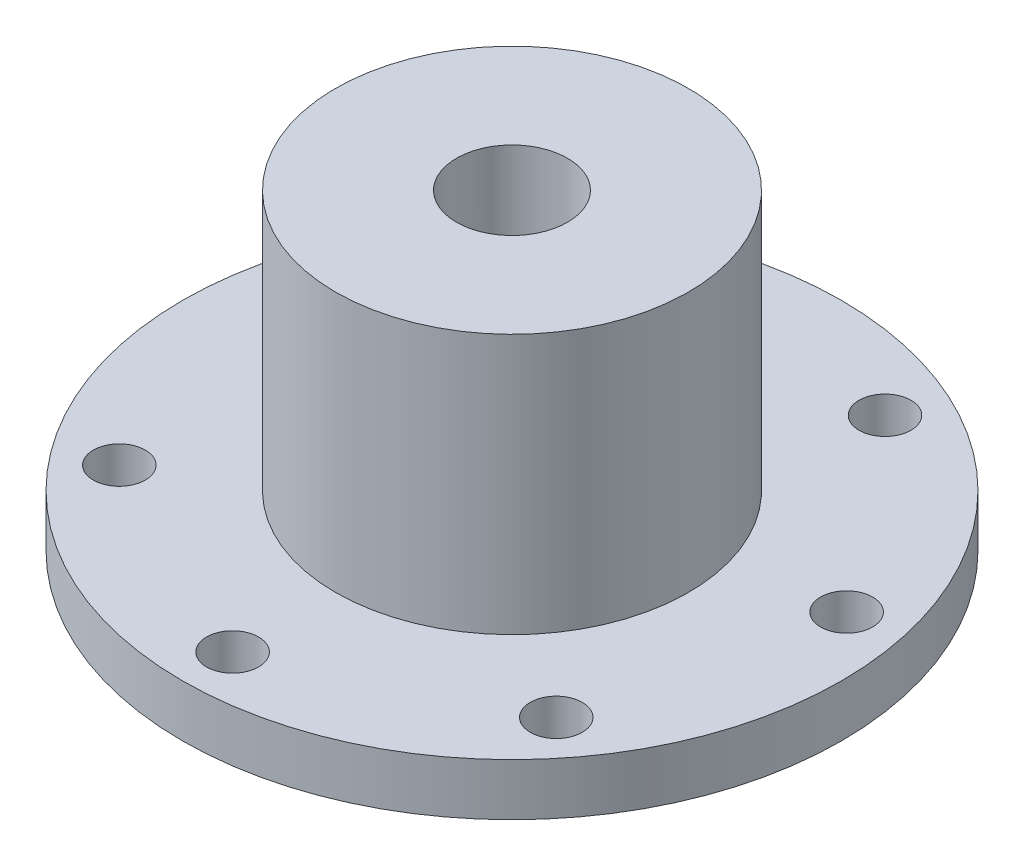
ISO-10303-21;
HEADER;
FILE_DESCRIPTION(('STEP AP214'),'2;1');
FILE_NAME('part.step','',(''),(''),'','','');
FILE_SCHEMA(('AUTOMOTIVE_DESIGN { 1 0 10303 214 1 1 1 1 }'));
ENDSEC;
DATA;
#1=APPLICATION_CONTEXT('core data for automotive mechanical design processes');
#2=APPLICATION_PROTOCOL_DEFINITION('international standard','automotive_design',2000,#1);
#3=PRODUCT_CONTEXT('',#1,'mechanical');
#4=PRODUCT('Part','Part','',(#3));
#5=PRODUCT_RELATED_PRODUCT_CATEGORY('part','',(#4));
#6=PRODUCT_DEFINITION_FORMATION('','',#4);
#7=PRODUCT_DEFINITION_CONTEXT('part definition',#1,'design');
#8=PRODUCT_DEFINITION('design','',#6,#7);
#9=PRODUCT_DEFINITION_SHAPE('','',#8);
#10=(LENGTH_UNIT() NAMED_UNIT(*) SI_UNIT(.MILLI.,.METRE.));
#11=(NAMED_UNIT(*) PLANE_ANGLE_UNIT() SI_UNIT($,.RADIAN.));
#12=(NAMED_UNIT(*) SI_UNIT($,.STERADIAN.) SOLID_ANGLE_UNIT());
#13=UNCERTAINTY_MEASURE_WITH_UNIT(LENGTH_MEASURE(1.E-05),#10,'distance_accuracy_value','');
#14=(GEOMETRIC_REPRESENTATION_CONTEXT(3) GLOBAL_UNCERTAINTY_ASSIGNED_CONTEXT((#13)) GLOBAL_UNIT_ASSIGNED_CONTEXT((#10,
#11,#12)) REPRESENTATION_CONTEXT('',''));
#15=CARTESIAN_POINT('',(0.,0.,0.));
#16=DIRECTION('',(0.,0.,1.));
#17=DIRECTION('',(1.,0.,0.));
#18=AXIS2_PLACEMENT_3D('',#15,#16,#17);
#19=CARTESIAN_POINT('',(0.,-3.,0.));
#20=DIRECTION('',(0.,1.,0.));
#21=DIRECTION('',(0.,0.,1.));
#22=AXIS2_PLACEMENT_3D('',#19,#20,#21);
#23=CYLINDRICAL_SURFACE('',#22,19.);
#24=CARTESIAN_POINT('',(0.,-3.,0.));
#25=DIRECTION('',(0.,1.,0.));
#26=DIRECTION('',(0.,0.,1.));
#27=AXIS2_PLACEMENT_3D('',#24,#25,#26);
#28=CIRCLE('',#27,19.);
#29=CARTESIAN_POINT('',(0.,-3.,19.));
#30=VERTEX_POINT('',#29);
#31=EDGE_CURVE('E39',#30,#30,#28,.T.);
#32=ORIENTED_EDGE('',*,*,#31,.T.);
#33=EDGE_LOOP('',(#32));
#34=FACE_BOUND('',#33,.T.);
#35=CARTESIAN_POINT('',(0.,0.,0.));
#36=DIRECTION('',(0.,1.,0.));
#37=DIRECTION('',(0.,0.,1.));
#38=AXIS2_PLACEMENT_3D('',#35,#36,#37);
#39=CIRCLE('',#38,19.);
#40=CARTESIAN_POINT('',(0.,0.,19.));
#41=VERTEX_POINT('',#40);
#42=EDGE_CURVE('E44',#41,#41,#39,.T.);
#43=ORIENTED_EDGE('',*,*,#42,.F.);
#44=EDGE_LOOP('',(#43));
#45=FACE_BOUND('',#44,.T.);
#46=ADVANCED_FACE('F32',(#34,#45),#23,.T.);
#47=CARTESIAN_POINT('',(0.,-3.,0.));
#48=DIRECTION('',(0.,1.,0.));
#49=DIRECTION('',(0.,0.,1.));
#50=AXIS2_PLACEMENT_3D('',#47,#48,#49);
#51=PLANE('',#50);
#52=CARTESIAN_POINT('',(0.,-3.,16.1125379466549));
#53=DIRECTION('',(0.,-1.,0.));
#54=DIRECTION('',(0.,0.,-1.));
#55=AXIS2_PLACEMENT_3D('',#52,#53,#54);
#56=CIRCLE('',#55,1.5);
#57=CARTESIAN_POINT('',(0.,-3.,14.6125379466549));
#58=VERTEX_POINT('',#57);
#59=EDGE_CURVE('E53',#58,#58,#56,.T.);
#60=ORIENTED_EDGE('',*,*,#59,.F.);
#61=EDGE_LOOP('',(#60));
#62=FACE_BOUND('',#61,.T.);
#63=CARTESIAN_POINT('',(-12.5972894291553,-3.,10.0460030918006));
#64=DIRECTION('',(0.,-1.,0.));
#65=DIRECTION('',(0.,0.,-1.));
#66=AXIS2_PLACEMENT_3D('',#63,#64,#65);
#67=CIRCLE('',#66,1.5);
#68=CARTESIAN_POINT('',(-12.5972894291553,-3.,8.54600309180057));
#69=VERTEX_POINT('',#68);
#70=EDGE_CURVE('E182',#69,#69,#67,.T.);
#71=ORIENTED_EDGE('',*,*,#70,.F.);
#72=EDGE_LOOP('',(#71));
#73=FACE_BOUND('',#72,.T.);
#74=CARTESIAN_POINT('',(-6.99096821096666,-3.,-14.5168950728328));
#75=DIRECTION('',(0.,-1.,0.));
#76=DIRECTION('',(0.,0.,-1.));
#77=AXIS2_PLACEMENT_3D('',#74,#75,#76);
#78=CIRCLE('',#77,1.5);
#79=CARTESIAN_POINT('',(-6.99096821096666,-3.,-16.0168950728328));
#80=VERTEX_POINT('',#79);
#81=EDGE_CURVE('E177',#80,#80,#78,.T.);
#82=ORIENTED_EDGE('',*,*,#81,.F.);
#83=EDGE_LOOP('',(#82));
#84=FACE_BOUND('',#83,.T.);
#85=CARTESIAN_POINT('',(-15.7085629802817,-3.,-3.58537699229698));
#86=DIRECTION('',(0.,-1.,0.));
#87=DIRECTION('',(0.,0.,-1.));
#88=AXIS2_PLACEMENT_3D('',#85,#86,#87);
#89=CIRCLE('',#88,1.5);
#90=CARTESIAN_POINT('',(-15.7085629802817,-3.,-5.08537699229698));
#91=VERTEX_POINT('',#90);
#92=EDGE_CURVE('E185',#91,#91,#89,.T.);
#93=ORIENTED_EDGE('',*,*,#92,.F.);
#94=EDGE_LOOP('',(#93));
#95=FACE_BOUND('',#94,.T.);
#96=CARTESIAN_POINT('',(12.5972894291559,-3.,10.0460030918018));
#97=DIRECTION('',(0.,-1.,0.));
#98=DIRECTION('',(0.,0.,-1.));
#99=AXIS2_PLACEMENT_3D('',#96,#97,#98);
#100=CIRCLE('',#99,1.5);
#101=CARTESIAN_POINT('',(12.5972894291559,-3.,8.54600309180181));
#102=VERTEX_POINT('',#101);
#103=EDGE_CURVE('E81',#102,#102,#100,.T.);
#104=ORIENTED_EDGE('',*,*,#103,.F.);
#105=EDGE_LOOP('',(#104));
#106=FACE_BOUND('',#105,.T.);
#107=CARTESIAN_POINT('',(15.7085629802836,-3.,-3.58537699229543));
#108=DIRECTION('',(0.,-1.,0.));
#109=DIRECTION('',(0.,0.,-1.));
#110=AXIS2_PLACEMENT_3D('',#107,#108,#109);
#111=CIRCLE('',#110,1.5);
#112=CARTESIAN_POINT('',(15.7085629802836,-3.,-5.08537699229543));
#113=VERTEX_POINT('',#112);
#114=EDGE_CURVE('E176',#113,#113,#111,.T.);
#115=ORIENTED_EDGE('',*,*,#114,.F.);
#116=EDGE_LOOP('',(#115));
#117=FACE_BOUND('',#116,.T.);
#118=CARTESIAN_POINT('',(6.99096821096968,-3.,-14.5168950728321));
#119=DIRECTION('',(0.,-1.,0.));
#120=DIRECTION('',(0.,0.,-1.));
#121=AXIS2_PLACEMENT_3D('',#118,#119,#120);
#122=CIRCLE('',#121,1.5);
#123=CARTESIAN_POINT('',(6.99096821096968,-3.,-16.0168950728321));
#124=VERTEX_POINT('',#123);
#125=EDGE_CURVE('E174',#124,#124,#122,.T.);
#126=ORIENTED_EDGE('',*,*,#125,.F.);
#127=EDGE_LOOP('',(#126));
#128=FACE_BOUND('',#127,.T.);
#129=CARTESIAN_POINT('',(0.,-3.,0.));
#130=DIRECTION('',(0.,1.,0.));
#131=DIRECTION('',(0.,0.,1.));
#132=AXIS2_PLACEMENT_3D('',#129,#130,#131);
#133=CIRCLE('',#132,4.5);
#134=CARTESIAN_POINT('',(0.,-3.,4.5));
#135=VERTEX_POINT('',#134);
#136=EDGE_CURVE('E10',#135,#135,#133,.F.);
#137=ORIENTED_EDGE('',*,*,#136,.F.);
#138=EDGE_LOOP('',(#137));
#139=FACE_BOUND('',#138,.T.);
#140=ORIENTED_EDGE('',*,*,#31,.F.);
#141=EDGE_LOOP('',(#140));
#142=FACE_BOUND('',#141,.T.);
#143=ADVANCED_FACE('F126',(#62,#73,#84,#95,#106,#117,#128,#139,#142),#51,.F.);
#144=CARTESIAN_POINT('',(0.,0.,0.));
#145=DIRECTION('',(0.,1.,0.));
#146=DIRECTION('',(0.,0.,1.));
#147=AXIS2_PLACEMENT_3D('',#144,#145,#146);
#148=PLANE('',#147);
#149=CARTESIAN_POINT('',(0.,0.,16.1125379466549));
#150=DIRECTION('',(0.,1.,0.));
#151=DIRECTION('',(0.,0.,1.));
#152=AXIS2_PLACEMENT_3D('',#149,#150,#151);
#153=CIRCLE('',#152,1.5);
#154=CARTESIAN_POINT('',(0.,0.,17.6125379466549));
#155=VERTEX_POINT('',#154);
#156=EDGE_CURVE('E35',#155,#155,#153,.T.);
#157=ORIENTED_EDGE('',*,*,#156,.F.);
#158=EDGE_LOOP('',(#157));
#159=FACE_BOUND('',#158,.T.);
#160=CARTESIAN_POINT('',(-12.5972894291553,0.,10.0460030918006));
#161=DIRECTION('',(0.,1.,0.));
#162=DIRECTION('',(0.,0.,1.));
#163=AXIS2_PLACEMENT_3D('',#160,#161,#162);
#164=CIRCLE('',#163,1.5);
#165=CARTESIAN_POINT('',(-12.5972894291553,0.,11.5460030918006));
#166=VERTEX_POINT('',#165);
#167=EDGE_CURVE('E64',#166,#166,#164,.T.);
#168=ORIENTED_EDGE('',*,*,#167,.F.);
#169=EDGE_LOOP('',(#168));
#170=FACE_BOUND('',#169,.T.);
#171=CARTESIAN_POINT('',(-6.99096821096666,0.,-14.5168950728328));
#172=DIRECTION('',(0.,1.,0.));
#173=DIRECTION('',(0.,0.,1.));
#174=AXIS2_PLACEMENT_3D('',#171,#172,#173);
#175=CIRCLE('',#174,1.5);
#176=CARTESIAN_POINT('',(-6.99096821096666,0.,-13.0168950728328));
#177=VERTEX_POINT('',#176);
#178=EDGE_CURVE('E62',#177,#177,#175,.T.);
#179=ORIENTED_EDGE('',*,*,#178,.F.);
#180=EDGE_LOOP('',(#179));
#181=FACE_BOUND('',#180,.T.);
#182=CARTESIAN_POINT('',(-15.7085629802817,0.,-3.58537699229698));
#183=DIRECTION('',(0.,1.,0.));
#184=DIRECTION('',(0.,0.,1.));
#185=AXIS2_PLACEMENT_3D('',#182,#183,#184);
#186=CIRCLE('',#185,1.5);
#187=CARTESIAN_POINT('',(-15.7085629802817,0.,-2.08537699229698));
#188=VERTEX_POINT('',#187);
#189=EDGE_CURVE('E59',#188,#188,#186,.T.);
#190=ORIENTED_EDGE('',*,*,#189,.F.);
#191=EDGE_LOOP('',(#190));
#192=FACE_BOUND('',#191,.T.);
#193=CARTESIAN_POINT('',(12.5972894291559,0.,10.0460030918018));
#194=DIRECTION('',(0.,1.,0.));
#195=DIRECTION('',(0.,0.,1.));
#196=AXIS2_PLACEMENT_3D('',#193,#194,#195);
#197=CIRCLE('',#196,1.5);
#198=CARTESIAN_POINT('',(12.5972894291559,0.,11.5460030918018));
#199=VERTEX_POINT('',#198);
#200=EDGE_CURVE('E56',#199,#199,#197,.T.);
#201=ORIENTED_EDGE('',*,*,#200,.F.);
#202=EDGE_LOOP('',(#201));
#203=FACE_BOUND('',#202,.T.);
#204=CARTESIAN_POINT('',(15.7085629802836,0.,-3.58537699229543));
#205=DIRECTION('',(0.,1.,0.));
#206=DIRECTION('',(0.,0.,1.));
#207=AXIS2_PLACEMENT_3D('',#204,#205,#206);
#208=CIRCLE('',#207,1.5);
#209=CARTESIAN_POINT('',(15.7085629802836,0.,-2.08537699229543));
#210=VERTEX_POINT('',#209);
#211=EDGE_CURVE('E52',#210,#210,#208,.T.);
#212=ORIENTED_EDGE('',*,*,#211,.F.);
#213=EDGE_LOOP('',(#212));
#214=FACE_BOUND('',#213,.T.);
#215=CARTESIAN_POINT('',(6.99096821096968,0.,-14.5168950728321));
#216=DIRECTION('',(0.,1.,0.));
#217=DIRECTION('',(0.,0.,1.));
#218=AXIS2_PLACEMENT_3D('',#215,#216,#217);
#219=CIRCLE('',#218,1.5);
#220=CARTESIAN_POINT('',(6.99096821096968,0.,-13.0168950728321));
#221=VERTEX_POINT('',#220);
#222=EDGE_CURVE('E49',#221,#221,#219,.T.);
#223=ORIENTED_EDGE('',*,*,#222,.F.);
#224=EDGE_LOOP('',(#223));
#225=FACE_BOUND('',#224,.T.);
#226=CARTESIAN_POINT('',(0.,0.,0.));
#227=DIRECTION('',(0.,1.,0.));
#228=DIRECTION('',(0.,0.,1.));
#229=AXIS2_PLACEMENT_3D('',#226,#227,#228);
#230=CIRCLE('',#229,10.175);
#231=CARTESIAN_POINT('',(0.,0.,10.175));
#232=VERTEX_POINT('',#231);
#233=EDGE_CURVE('E138',#232,#232,#230,.T.);
#234=ORIENTED_EDGE('',*,*,#233,.F.);
#235=EDGE_LOOP('',(#234));
#236=FACE_BOUND('',#235,.T.);
#237=ORIENTED_EDGE('',*,*,#42,.T.);
#238=EDGE_LOOP('',(#237));
#239=FACE_BOUND('',#238,.T.);
#240=ADVANCED_FACE('F121',(#159,#170,#181,#192,#203,#214,#225,#236,#239),#148,.T.);
#241=CARTESIAN_POINT('',(0.,-3.,0.));
#242=DIRECTION('',(0.,1.,0.));
#243=DIRECTION('',(0.,0.,1.));
#244=AXIS2_PLACEMENT_3D('',#241,#242,#243);
#245=CYLINDRICAL_SURFACE('',#244,3.2);
#246=CARTESIAN_POINT('',(-2.94575966433109,6.70287031675798,-1.25));
#247=CARTESIAN_POINT('',(-2.9457561040221,6.63560070393694,-1.25000364657164));
#248=CARTESIAN_POINT('',(-2.94808882070648,6.56835384204205,-1.24455189060455));
#249=CARTESIAN_POINT('',(-2.95709455657428,6.43590116893962,-1.22299938450571));
#250=CARTESIAN_POINT('',(-2.96376717792717,6.37069517122427,-1.20689961045456));
#251=CARTESIAN_POINT('',(-2.98058397535159,6.24427962646716,-1.16474315395725));
#252=CARTESIAN_POINT('',(-2.99071918220738,6.18306023583419,-1.13871217640466));
#253=CARTESIAN_POINT('',(-3.0133041231061,6.06583302082183,-1.0775243065904));
#254=CARTESIAN_POINT('',(-3.02575461018433,6.0098269009557,-1.04236444371825));
#255=CARTESIAN_POINT('',(-3.05232056093237,5.90158964271138,-0.961882537045419));
#256=CARTESIAN_POINT('',(-3.06648778331493,5.84967938274004,-0.916145927581944));
#257=CARTESIAN_POINT('',(-3.09446118863288,5.7540367680782,-0.816686367925391));
#258=CARTESIAN_POINT('',(-3.10826728518756,5.71030635488202,-0.76296152713554));
#259=CARTESIAN_POINT('',(-3.13458470448662,5.63068173224277,-0.646578607988386));
#260=CARTESIAN_POINT('',(-3.14702836206866,5.59514142730764,-0.583661724267194));
#261=CARTESIAN_POINT('',(-3.16859150767881,5.53528508834105,-0.452169183290857));
#262=CARTESIAN_POINT('',(-3.17771225454635,5.51096480282641,-0.38359568106803));
#263=CARTESIAN_POINT('',(-3.19123406438716,5.47537966708552,-0.246113452765575));
#264=CARTESIAN_POINT('',(-3.19583453714007,5.46356125736242,-0.177368008846381));
#265=CARTESIAN_POINT('',(-3.20051625373028,5.4515361985495,-0.0387258704459619));
#266=CARTESIAN_POINT('',(-3.2005990925706,5.45132545123962,0.0311704090008713));
#267=CARTESIAN_POINT('',(-3.19635963291807,5.46221106074782,0.166141831320984));
#268=CARTESIAN_POINT('',(-3.19227326141674,5.47270183487828,0.23127454773314));
#269=CARTESIAN_POINT('',(-3.18046927782357,5.50366697223485,0.358769966921173));
#270=CARTESIAN_POINT('',(-3.17275140664533,5.52414204778665,0.421132471711071));
#271=CARTESIAN_POINT('',(-3.15429816449428,5.57474871186138,0.542425858882155));
#272=CARTESIAN_POINT('',(-3.14351952041714,5.60501972049211,0.601291716017175));
#273=CARTESIAN_POINT('',(-3.12002246931066,5.67423125731948,0.713258300697125));
#274=CARTESIAN_POINT('',(-3.10730341045361,5.71317470080494,0.766357080655314));
#275=CARTESIAN_POINT('',(-3.08027893980722,5.80148643278428,0.868829539928292));
#276=CARTESIAN_POINT('',(-3.0659240690551,5.85135668355726,0.917758234888911));
#277=CARTESIAN_POINT('',(-3.03787202523488,5.95866255892212,1.00673474849934));
#278=CARTESIAN_POINT('',(-3.0241750484077,6.01610042194186,1.04677993004776));
#279=CARTESIAN_POINT('',(-2.99866252110428,6.13881075353856,1.11780520059516));
#280=CARTESIAN_POINT('',(-2.98690477617467,6.20424739929872,1.14852412025546));
#281=CARTESIAN_POINT('',(-2.96727553740097,6.33994624917864,1.19833267161382));
#282=CARTESIAN_POINT('',(-2.95940165902152,6.4102054621759,1.21742944052591));
#283=CARTESIAN_POINT('',(-2.94900416362147,6.54913048363853,1.24239598649504));
#284=CARTESIAN_POINT('',(-2.94619274010065,6.61764641138657,1.24897856341943));
#285=CARTESIAN_POINT('',(-2.94542040104541,6.75484654962888,1.25080034560896));
#286=CARTESIAN_POINT('',(-2.94745811809252,6.82353070722735,1.24604274871091));
#287=CARTESIAN_POINT('',(-2.95586023230417,6.95527725476111,1.22596727250261));
#288=CARTESIAN_POINT('',(-2.96198847393265,7.01844425240373,1.2112251742328));
#289=CARTESIAN_POINT('',(-2.97759308035135,7.14137133585027,1.17233748774598));
#290=CARTESIAN_POINT('',(-2.9870701660654,7.20113068485161,1.14818987463826));
#291=CARTESIAN_POINT('',(-3.00876302333376,7.31817224527662,1.09010981183241));
#292=CARTESIAN_POINT('',(-3.02107208444302,7.37526373862952,1.05582894077743));
#293=CARTESIAN_POINT('',(-3.04689425767089,7.48313498724718,0.978817089674869));
#294=CARTESIAN_POINT('',(-3.06040784063498,7.53391225555178,0.936082797170452));
#295=CARTESIAN_POINT('',(-3.08825607589474,7.63139601092401,0.839851554807137));
#296=CARTESIAN_POINT('',(-3.10258217827602,7.67757073989664,0.785811476372662));
#297=CARTESIAN_POINT('',(-3.12954730408296,7.76027173287226,0.67040351973552));
#298=CARTESIAN_POINT('',(-3.14218628460323,7.79679775152095,0.609035455249189));
#299=CARTESIAN_POINT('',(-3.16437302997273,7.85898518881193,0.480601933497054));
#300=CARTESIAN_POINT('',(-3.17392564144841,7.88466366140472,0.413545619838087));
#301=CARTESIAN_POINT('',(-3.18886264818041,7.92421550596957,0.275602545298738));
#302=CARTESIAN_POINT('',(-3.19424919097152,7.93809496049332,0.20471777810681));
#303=CARTESIAN_POINT('',(-3.20002769406212,7.95295799490693,0.0659161382718319));
#304=CARTESIAN_POINT('',(-3.20071131287078,7.95469474062586,-0.00190859890933502));
#305=CARTESIAN_POINT('',(-3.1977843687784,7.94719232046517,-0.136846626396312));
#306=CARTESIAN_POINT('',(-3.19417440086839,7.93795467538043,-0.203960013978417));
#307=CARTESIAN_POINT('',(-3.18320718387787,7.90930110088001,-0.333633924923678));
#308=CARTESIAN_POINT('',(-3.17595862453487,7.89017993957,-0.396269496009316));
#309=CARTESIAN_POINT('',(-3.1584819525545,7.84260547732184,-0.51743865055117));
#310=CARTESIAN_POINT('',(-3.14825327666502,7.81415041211622,-0.575971455973966));
#311=CARTESIAN_POINT('',(-3.12527461116172,7.74731604142999,-0.690067308938188));
#312=CARTESIAN_POINT('',(-3.1124343208935,7.70855897275364,-0.745390518456527));
#313=CARTESIAN_POINT('',(-3.08579149624345,7.62279929647456,-0.8489735314487));
#314=CARTESIAN_POINT('',(-3.07198860947809,7.57579365961914,-0.8972307279734));
#315=CARTESIAN_POINT('',(-3.04398026334394,7.4716177037823,-0.988222082904592));
#316=CARTESIAN_POINT('',(-3.02979830940948,7.41401431463146,-1.03046966462778));
#317=CARTESIAN_POINT('',(-3.00352013641294,7.29208452325222,-1.10472787682894));
#318=CARTESIAN_POINT('',(-2.99142449188109,7.22775627693305,-1.13673568953545));
#319=CARTESIAN_POINT('',(-2.97005301256798,7.08861027398564,-1.19152392504768));
#320=CARTESIAN_POINT('',(-2.96108309112199,7.01336496080054,-1.21335250796269));
#321=CARTESIAN_POINT('',(-2.94894090768994,6.85969109849323,-1.24258240800534));
#322=CARTESIAN_POINT('',(-2.94576381345881,6.7812652583788,-1.24999575034315));
#323=CARTESIAN_POINT('',(-2.94575966433109,6.70287031675798,-1.25));
#324=B_SPLINE_CURVE_WITH_KNOTS('',3,(#246,#247,#248,#249,#250,#251,#252,#253,#254,#255,#256,
#257,#258,#259,#260,#261,#262,#263,#264,#265,#266,#267,#268,#269,#270,#271,#272,#273,#274,#275,
#276,#277,#278,#279,#280,#281,#282,#283,#284,#285,#286,#287,#288,#289,#290,#291,#292,#293,#294,
#295,#296,#297,#298,#299,#300,#301,#302,#303,#304,#305,#306,#307,#308,#309,#310,#311,#312,#313,
#314,#315,#316,#317,#318,#319,#320,#321,#322,#323),.UNSPECIFIED.,.T.,.F.,(4,2,2,2,2,2,2,2,2,2,2,
2,2,2,2,2,2,2,2,2,2,2,2,2,2,2,2,2,2,2,2,2,2,2,2,2,2,2,4),(0.,0.201516302527443,
0.403014135054975,0.60399393146872,0.805039210421977,1.01596679250102,1.22694437508962,
1.44580610088325,1.66458482746792,1.87320922455329,2.08175996389968,2.27913002958156,
2.47651417860659,2.67684117854321,2.87723562147737,3.0902463305842,3.30332018828473,
3.52190349012223,3.7403524231834,3.94593509718358,4.15145980540013,4.34604114859785,
4.54066440592075,4.74296531718605,4.94534565726318,5.16185629198255,5.37837243175931,
5.59454689769616,5.81060985510761,6.01314195922448,6.21564600038359,6.4124319641466,
6.60925514527652,6.81463756758065,7.02009557419006,7.23754214843322,7.45504850808425,
7.69008857114678,7.92493247926189),.UNSPECIFIED.);
#325=CARTESIAN_POINT('',(-2.94575966433109,6.70287031675798,-1.25));
#326=VERTEX_POINT('',#325);
#327=EDGE_CURVE('E84',#326,#326,#324,.T.);
#328=ORIENTED_EDGE('',*,*,#327,.T.);
#329=EDGE_LOOP('',(#328));
#330=FACE_BOUND('',#329,.T.);
#331=CARTESIAN_POINT('',(0.,15.,0.));
#332=DIRECTION('',(0.,1.,0.));
#333=DIRECTION('',(0.,0.,1.));
#334=AXIS2_PLACEMENT_3D('',#331,#332,#333);
#335=CIRCLE('',#334,3.2);
#336=CARTESIAN_POINT('',(0.,15.,3.2));
#337=VERTEX_POINT('',#336);
#338=EDGE_CURVE('E91',#337,#337,#335,.T.);
#339=ORIENTED_EDGE('',*,*,#338,.T.);
#340=EDGE_LOOP('',(#339));
#341=FACE_BOUND('',#340,.T.);
#342=CARTESIAN_POINT('',(0.,-13.,0.));
#343=DIRECTION('',(0.,1.,0.));
#344=DIRECTION('',(0.,0.,1.));
#345=AXIS2_PLACEMENT_3D('',#342,#343,#344);
#346=CIRCLE('',#345,3.2);
#347=CARTESIAN_POINT('',(0.,-13.,3.2));
#348=VERTEX_POINT('',#347);
#349=EDGE_CURVE('E69',#348,#348,#346,.T.);
#350=ORIENTED_EDGE('',*,*,#349,.F.);
#351=EDGE_LOOP('',(#350));
#352=FACE_BOUND('',#351,.T.);
#353=ADVANCED_FACE('F93',(#330,#341,#352),#245,.F.);
#354=CARTESIAN_POINT('',(0.,-3.,0.));
#355=DIRECTION('',(0.,1.,0.));
#356=DIRECTION('',(0.,0.,1.));
#357=AXIS2_PLACEMENT_3D('',#354,#355,#356);
#358=CYLINDRICAL_SURFACE('',#357,10.175);
#359=ORIENTED_EDGE('',*,*,#233,.T.);
#360=EDGE_LOOP('',(#359));
#361=FACE_BOUND('',#360,.T.);
#362=CARTESIAN_POINT('',(-10.0979267674112,6.70287031675798,-1.25));
#363=CARTESIAN_POINT('',(-10.0979277567119,6.63294209678968,-1.24999702117347));
#364=CARTESIAN_POINT('',(-10.098660989438,6.5629699314626,-1.24411225600033));
#365=CARTESIAN_POINT('',(-10.1015136527258,6.42497224272097,-1.22072941502396));
#366=CARTESIAN_POINT('',(-10.1036345392657,6.35694884235837,-1.20321914101821));
#367=CARTESIAN_POINT('',(-10.1090187397985,6.22486668543763,-1.15710868042337));
#368=CARTESIAN_POINT('',(-10.112281286121,6.16080529873433,-1.12851594447285));
#369=CARTESIAN_POINT('',(-10.1195802728128,6.0384022282688,-1.06106800291716));
#370=CARTESIAN_POINT('',(-10.1236165788337,5.98005955421722,-1.02221457843941));
#371=CARTESIAN_POINT('',(-10.1320327534492,5.87042226085155,-0.935122929110065));
#372=CARTESIAN_POINT('',(-10.1364141875578,5.819163051448,-0.886840274107669));
#373=CARTESIAN_POINT('',(-10.1450128511347,5.72545353391458,-0.782356322285848));
#374=CARTESIAN_POINT('',(-10.1492300724892,5.68300366060329,-0.726154634821974));
#375=CARTESIAN_POINT('',(-10.1570411201161,5.60799117392585,-0.607205876629296));
#376=CARTESIAN_POINT('',(-10.1606329137788,5.57546054951873,-0.544438487916193));
#377=CARTESIAN_POINT('',(-10.1667712159856,5.52141485332,-0.414280108233074));
#378=CARTESIAN_POINT('',(-10.1693177620579,5.49989938603718,-0.346889283362706));
#379=CARTESIAN_POINT('',(-10.1730676197643,5.46860038833602,-0.209758829866752));
#380=CARTESIAN_POINT('',(-10.1742776636354,5.45875803932289,-0.140032813180413));
#381=CARTESIAN_POINT('',(-10.1752411587735,5.45090240648273,9.10519123485616E-05));
#382=CARTESIAN_POINT('',(-10.174994665498,5.45288867228171,0.07048887463789));
#383=CARTESIAN_POINT('',(-10.1730783123968,5.46858669091601,0.209557917520229));
#384=CARTESIAN_POINT('',(-10.1714161315331,5.48223518686338,0.278236398762059));
#385=CARTESIAN_POINT('',(-10.1668638099742,5.52077138345757,0.412320638399237));
#386=CARTESIAN_POINT('',(-10.1639736466098,5.54565929158903,0.47772633635276));
#387=CARTESIAN_POINT('',(-10.1572768947706,5.60603530219423,0.603604549466119));
#388=CARTESIAN_POINT('',(-10.1534679396128,5.64155083776357,0.664063775642886));
#389=CARTESIAN_POINT('',(-10.1453598643397,5.72215399484622,0.778187862545911));
#390=CARTESIAN_POINT('',(-10.1410607225124,5.76724204043465,0.83185242209106));
#391=CARTESIAN_POINT('',(-10.1324200257512,5.86606476395423,0.931235360911623));
#392=CARTESIAN_POINT('',(-10.1280783781894,5.91985456127976,0.97689894093977));
#393=CARTESIAN_POINT('',(-10.1198700419953,6.03436438027668,1.05855795562455));
#394=CARTESIAN_POINT('',(-10.1160033547619,6.09508442235687,1.09455336180843));
#395=CARTESIAN_POINT('',(-10.1091827486496,6.2217793062093,1.15585706440657));
#396=CARTESIAN_POINT('',(-10.1062291967207,6.28775624714439,1.18116106589542));
#397=CARTESIAN_POINT('',(-10.1015764727871,6.4230671479615,1.22031556980391));
#398=CARTESIAN_POINT('',(-10.099877242461,6.49240095160219,1.23416660474731));
#399=CARTESIAN_POINT('',(-10.0979361682604,6.63197373709987,1.24994961916656));
#400=CARTESIAN_POINT('',(-10.0976849002097,6.70220387703278,1.25195867505502));
#401=CARTESIAN_POINT('',(-10.0986432811473,6.84199974412146,1.24420398011413));
#402=CARTESIAN_POINT('',(-10.0998529000848,6.91156548491442,1.23444047144922));
#403=CARTESIAN_POINT('',(-10.1035881644628,7.04782745448572,1.20348265560917));
#404=CARTESIAN_POINT('',(-10.1061095216833,7.11453227139031,1.18232558739361));
#405=CARTESIAN_POINT('',(-10.1121806925892,7.24344739863303,1.1292195273252));
#406=CARTESIAN_POINT('',(-10.1157305412395,7.30565755607938,1.09727016856798));
#407=CARTESIAN_POINT('',(-10.1234813141965,7.42416641058603,1.0232966079243));
#408=CARTESIAN_POINT('',(-10.127685469456,7.48043331131556,0.981221810967214));
#409=CARTESIAN_POINT('',(-10.1362609694169,7.58513420317838,0.888263338802318));
#410=CARTESIAN_POINT('',(-10.1406323203908,7.63356790008706,0.837379332858492));
#411=CARTESIAN_POINT('',(-10.1490785737699,7.72149781824034,0.727910371350939));
#412=CARTESIAN_POINT('',(-10.1531517137883,7.76094342686754,0.66928460630418));
#413=CARTESIAN_POINT('',(-10.1605163253386,7.82942742754084,0.546195051269558));
#414=CARTESIAN_POINT('',(-10.1638078121643,7.85846602321685,0.481731375540709));
#415=CARTESIAN_POINT('',(-10.1692304211336,7.90522791390102,0.348964870322191));
#416=CARTESIAN_POINT('',(-10.1713645534698,7.92298058370452,0.280672514997531));
#417=CARTESIAN_POINT('',(-10.1742444810891,7.94676227924847,0.142048448961794));
#418=CARTESIAN_POINT('',(-10.1749903367355,7.95279181472005,0.0717168270545996));
#419=CARTESIAN_POINT('',(-10.1750094132448,7.95294678466827,-0.0684948478882878));
#420=CARTESIAN_POINT('',(-10.1742922946867,7.94715031079634,-0.138374826189857));
#421=CARTESIAN_POINT('',(-10.1714851852016,7.9239830421306,-0.276159537977999));
#422=CARTESIAN_POINT('',(-10.1693951950058,7.90661225350027,-0.344064272516397));
#423=CARTESIAN_POINT('',(-10.1640761658639,7.86081370742,-0.475961589657634));
#424=CARTESIAN_POINT('',(-10.1608474985012,7.83238955669262,-0.539955440511816));
#425=CARTESIAN_POINT('',(-10.1536088499237,7.76529923539667,-0.662277178466184));
#426=CARTESIAN_POINT('',(-10.1495988607067,7.72663295992839,-0.720605007526689));
#427=CARTESIAN_POINT('',(-10.1412137307483,7.63986661612755,-0.830338113666411));
#428=CARTESIAN_POINT('',(-10.1368364406919,7.59170842155335,-0.881697268420264));
#429=CARTESIAN_POINT('',(-10.1282274027212,7.48744566186166,-0.975636149597502));
#430=CARTESIAN_POINT('',(-10.1239956895634,7.43133921523151,-1.01821379138066));
#431=CARTESIAN_POINT('',(-10.1161400971111,7.31253320902253,-1.09351616096574));
#432=CARTESIAN_POINT('',(-10.1125185452514,7.24980982480512,-1.12620352372044));
#433=CARTESIAN_POINT('',(-10.1063206267835,7.11975519970497,-1.18053498784727));
#434=CARTESIAN_POINT('',(-10.1037431200425,7.05242907961976,-1.20219114236891));
#435=CARTESIAN_POINT('',(-10.1005532671621,6.93777111497256,-1.22864023942799));
#436=CARTESIAN_POINT('',(-10.0995732113716,6.8911634972544,-1.23663868581638));
#437=CARTESIAN_POINT('',(-10.0982596296589,6.7973340412629,-1.24731955309882));
#438=CARTESIAN_POINT('',(-10.0979260990625,6.75011220743271,-1.25000201242642));
#439=CARTESIAN_POINT('',(-10.0979267674112,6.70287031675798,-1.25));
#440=B_SPLINE_CURVE_WITH_KNOTS('',3,(#362,#363,#364,#365,#366,#367,#368,#369,#370,#371,#372,
#373,#374,#375,#376,#377,#378,#379,#380,#381,#382,#383,#384,#385,#386,#387,#388,#389,#390,#391,
#392,#393,#394,#395,#396,#397,#398,#399,#400,#401,#402,#403,#404,#405,#406,#407,#408,#409,#410,
#411,#412,#413,#414,#415,#416,#417,#418,#419,#420,#421,#422,#423,#424,#425,#426,#427,#428,#429,
#430,#431,#432,#433,#434,#435,#436,#437,#438,#439),.UNSPECIFIED.,.T.,.F.,(4,2,2,2,2,2,2,2,2,2,2,
2,2,2,2,2,2,2,2,2,2,2,2,2,2,2,2,2,2,2,2,2,2,2,2,2,2,2,4),(0.,0.20961208351461,0.419444453308986,
0.629135998708564,0.838791168172494,1.04945915763315,1.26013754294853,1.47148833712573,
1.68283154237404,1.89310524330275,2.10337093812058,2.31250332218604,2.52163956708797,
2.73132038179661,2.94101048758773,3.15208495582656,3.36316004567258,3.5743198476637,
3.7854698308945,3.99524396195052,4.20501377797693,4.41410210239424,4.62319753588102,
4.83336030781435,5.04353097188388,5.25485738334636,5.46617965964263,5.67694963377872,
5.88771044326507,6.09708402377413,6.3064574927888,6.51576270028999,6.7250700515751,
6.93570137412301,7.14638264095937,7.35785019013532,7.56908618289873,7.71069629011579,
7.85230537351569),.UNSPECIFIED.);
#441=CARTESIAN_POINT('',(-10.0979267674112,6.70287031675798,-1.25));
#442=VERTEX_POINT('',#441);
#443=EDGE_CURVE('E78',#442,#442,#440,.T.);
#444=ORIENTED_EDGE('',*,*,#443,.F.);
#445=EDGE_LOOP('',(#444));
#446=FACE_BOUND('',#445,.T.);
#447=CARTESIAN_POINT('',(0.,15.,0.));
#448=DIRECTION('',(0.,1.,0.));
#449=DIRECTION('',(0.,0.,1.));
#450=AXIS2_PLACEMENT_3D('',#447,#448,#449);
#451=CIRCLE('',#450,10.175);
#452=CARTESIAN_POINT('',(0.,15.,10.175));
#453=VERTEX_POINT('',#452);
#454=EDGE_CURVE('E111',#453,#453,#451,.T.);
#455=ORIENTED_EDGE('',*,*,#454,.F.);
#456=EDGE_LOOP('',(#455));
#457=FACE_BOUND('',#456,.T.);
#458=ADVANCED_FACE('F112',(#361,#446,#457),#358,.T.);
#459=CARTESIAN_POINT('',(0.,15.,0.));
#460=DIRECTION('',(0.,1.,0.));
#461=DIRECTION('',(0.,0.,1.));
#462=AXIS2_PLACEMENT_3D('',#459,#460,#461);
#463=PLANE('',#462);
#464=ORIENTED_EDGE('',*,*,#338,.F.);
#465=EDGE_LOOP('',(#464));
#466=FACE_BOUND('',#465,.T.);
#467=ORIENTED_EDGE('',*,*,#454,.T.);
#468=EDGE_LOOP('',(#467));
#469=FACE_BOUND('',#468,.T.);
#470=ADVANCED_FACE('F103',(#466,#469),#463,.T.);
#471=CARTESIAN_POINT('',(-15.,6.70287031675798,0.));
#472=DIRECTION('',(1.,0.,0.));
#473=DIRECTION('',(0.,0.,-1.));
#474=AXIS2_PLACEMENT_3D('',#471,#472,#473);
#475=CYLINDRICAL_SURFACE('',#474,1.25);
#476=ORIENTED_EDGE('',*,*,#443,.T.);
#477=EDGE_LOOP('',(#476));
#478=FACE_BOUND('',#477,.T.);
#479=ORIENTED_EDGE('',*,*,#327,.F.);
#480=EDGE_LOOP('',(#479));
#481=FACE_BOUND('',#480,.T.);
#482=ADVANCED_FACE('F97',(#478,#481),#475,.F.);
#483=CARTESIAN_POINT('',(0.,-13.,0.));
#484=DIRECTION('',(0.,1.,0.));
#485=DIRECTION('',(0.,0.,1.));
#486=AXIS2_PLACEMENT_3D('',#483,#484,#485);
#487=CYLINDRICAL_SURFACE('',#486,4.5);
#488=CARTESIAN_POINT('',(0.,-13.,0.));
#489=DIRECTION('',(0.,-1.,0.));
#490=DIRECTION('',(0.,0.,-1.));
#491=AXIS2_PLACEMENT_3D('',#488,#489,#490);
#492=CIRCLE('',#491,4.5);
#493=CARTESIAN_POINT('',(0.,-13.,-4.5));
#494=VERTEX_POINT('',#493);
#495=EDGE_CURVE('E73',#494,#494,#492,.T.);
#496=ORIENTED_EDGE('',*,*,#495,.F.);
#497=EDGE_LOOP('',(#496));
#498=FACE_BOUND('',#497,.T.);
#499=ORIENTED_EDGE('',*,*,#136,.T.);
#500=EDGE_LOOP('',(#499));
#501=FACE_BOUND('',#500,.T.);
#502=ADVANCED_FACE('F102',(#498,#501),#487,.T.);
#503=CARTESIAN_POINT('',(0.,-13.,0.));
#504=DIRECTION('',(0.,-1.,0.));
#505=DIRECTION('',(0.,0.,-1.));
#506=AXIS2_PLACEMENT_3D('',#503,#504,#505);
#507=PLANE('',#506);
#508=ORIENTED_EDGE('',*,*,#349,.T.);
#509=EDGE_LOOP('',(#508));
#510=FACE_BOUND('',#509,.T.);
#511=ORIENTED_EDGE('',*,*,#495,.T.);
#512=EDGE_LOOP('',(#511));
#513=FACE_BOUND('',#512,.T.);
#514=ADVANCED_FACE('F170',(#510,#513),#507,.T.);
#515=CARTESIAN_POINT('',(6.99096821096968,7.,-14.5168950728321));
#516=DIRECTION('',(0.,-1.,0.));
#517=DIRECTION('',(0.,0.,-1.));
#518=AXIS2_PLACEMENT_3D('',#515,#516,#517);
#519=CYLINDRICAL_SURFACE('',#518,1.5);
#520=ORIENTED_EDGE('',*,*,#222,.T.);
#521=EDGE_LOOP('',(#520));
#522=FACE_BOUND('',#521,.T.);
#523=ORIENTED_EDGE('',*,*,#125,.T.);
#524=EDGE_LOOP('',(#523));
#525=FACE_BOUND('',#524,.T.);
#526=ADVANCED_FACE('F166',(#522,#525),#519,.F.);
#527=CARTESIAN_POINT('',(15.7085629802836,7.,-3.58537699229543));
#528=DIRECTION('',(0.,-1.,0.));
#529=DIRECTION('',(0.,0.,-1.));
#530=AXIS2_PLACEMENT_3D('',#527,#528,#529);
#531=CYLINDRICAL_SURFACE('',#530,1.5);
#532=ORIENTED_EDGE('',*,*,#211,.T.);
#533=EDGE_LOOP('',(#532));
#534=FACE_BOUND('',#533,.T.);
#535=ORIENTED_EDGE('',*,*,#114,.T.);
#536=EDGE_LOOP('',(#535));
#537=FACE_BOUND('',#536,.T.);
#538=ADVANCED_FACE('F169',(#534,#537),#531,.F.);
#539=CARTESIAN_POINT('',(12.5972894291559,7.,10.0460030918018));
#540=DIRECTION('',(0.,-1.,0.));
#541=DIRECTION('',(0.,0.,-1.));
#542=AXIS2_PLACEMENT_3D('',#539,#540,#541);
#543=CYLINDRICAL_SURFACE('',#542,1.5);
#544=ORIENTED_EDGE('',*,*,#200,.T.);
#545=EDGE_LOOP('',(#544));
#546=FACE_BOUND('',#545,.T.);
#547=ORIENTED_EDGE('',*,*,#103,.T.);
#548=EDGE_LOOP('',(#547));
#549=FACE_BOUND('',#548,.T.);
#550=ADVANCED_FACE('F194',(#546,#549),#543,.F.);
#551=CARTESIAN_POINT('',(-15.7085629802817,7.,-3.58537699229698));
#552=DIRECTION('',(0.,-1.,0.));
#553=DIRECTION('',(0.,0.,-1.));
#554=AXIS2_PLACEMENT_3D('',#551,#552,#553);
#555=CYLINDRICAL_SURFACE('',#554,1.5);
#556=ORIENTED_EDGE('',*,*,#189,.T.);
#557=EDGE_LOOP('',(#556));
#558=FACE_BOUND('',#557,.T.);
#559=ORIENTED_EDGE('',*,*,#92,.T.);
#560=EDGE_LOOP('',(#559));
#561=FACE_BOUND('',#560,.T.);
#562=ADVANCED_FACE('F207',(#558,#561),#555,.F.);
#563=CARTESIAN_POINT('',(-6.99096821096666,7.,-14.5168950728328));
#564=DIRECTION('',(0.,-1.,0.));
#565=DIRECTION('',(0.,0.,-1.));
#566=AXIS2_PLACEMENT_3D('',#563,#564,#565);
#567=CYLINDRICAL_SURFACE('',#566,1.5);
#568=ORIENTED_EDGE('',*,*,#178,.T.);
#569=EDGE_LOOP('',(#568));
#570=FACE_BOUND('',#569,.T.);
#571=ORIENTED_EDGE('',*,*,#81,.T.);
#572=EDGE_LOOP('',(#571));
#573=FACE_BOUND('',#572,.T.);
#574=ADVANCED_FACE('F215',(#570,#573),#567,.F.);
#575=CARTESIAN_POINT('',(-12.5972894291553,7.,10.0460030918006));
#576=DIRECTION('',(0.,-1.,0.));
#577=DIRECTION('',(0.,0.,-1.));
#578=AXIS2_PLACEMENT_3D('',#575,#576,#577);
#579=CYLINDRICAL_SURFACE('',#578,1.5);
#580=ORIENTED_EDGE('',*,*,#167,.T.);
#581=EDGE_LOOP('',(#580));
#582=FACE_BOUND('',#581,.T.);
#583=ORIENTED_EDGE('',*,*,#70,.T.);
#584=EDGE_LOOP('',(#583));
#585=FACE_BOUND('',#584,.T.);
#586=ADVANCED_FACE('F211',(#582,#585),#579,.F.);
#587=CARTESIAN_POINT('',(0.,7.,16.1125379466549));
#588=DIRECTION('',(0.,-1.,0.));
#589=DIRECTION('',(0.,0.,-1.));
#590=AXIS2_PLACEMENT_3D('',#587,#588,#589);
#591=CYLINDRICAL_SURFACE('',#590,1.5);
#592=ORIENTED_EDGE('',*,*,#156,.T.);
#593=EDGE_LOOP('',(#592));
#594=FACE_BOUND('',#593,.T.);
#595=ORIENTED_EDGE('',*,*,#59,.T.);
#596=EDGE_LOOP('',(#595));
#597=FACE_BOUND('',#596,.T.);
#598=ADVANCED_FACE('F298',(#594,#597),#591,.F.);
#599=CLOSED_SHELL('',(#46,#143,#240,#353,#458,#470,#482,#502,#514,#526,#538,#550,#562,#574,#586,#598));
#600=MANIFOLD_SOLID_BREP('B2',#599);
#601=ADVANCED_BREP_SHAPE_REPRESENTATION('',(#18,#600),#14);
#602=SHAPE_DEFINITION_REPRESENTATION(#9,#601);
ENDSEC;
END-ISO-10303-21;
